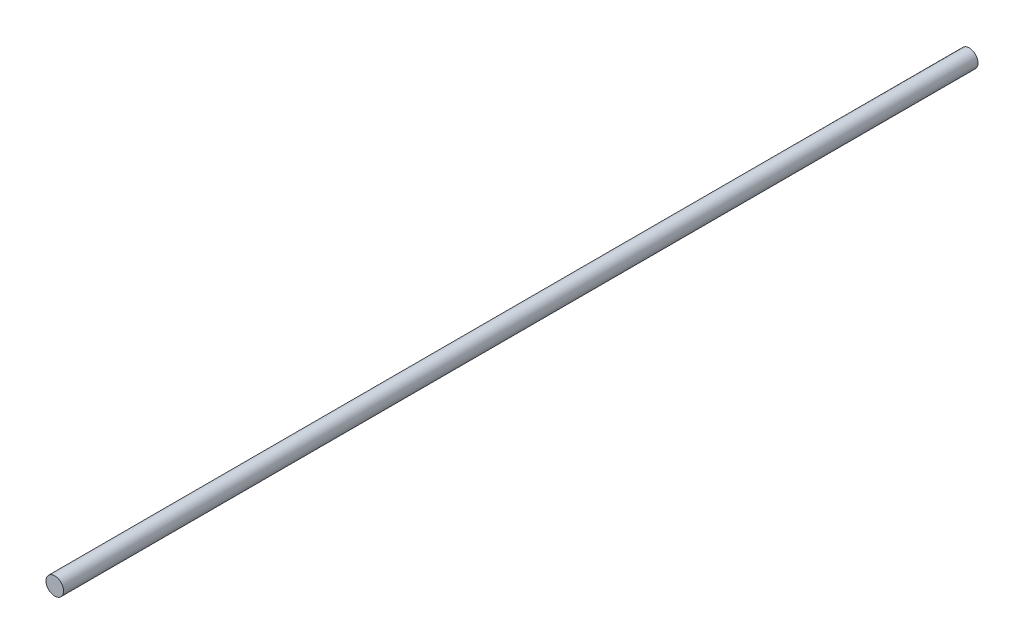
ISO-10303-21;
HEADER;
FILE_DESCRIPTION(('STEP AP214'),'2;1');
FILE_NAME('part.step','',(''),(''),'','','');
FILE_SCHEMA(('AUTOMOTIVE_DESIGN { 1 0 10303 214 1 1 1 1 }'));
ENDSEC;
DATA;
#1=APPLICATION_CONTEXT('core data for automotive mechanical design processes');
#2=APPLICATION_PROTOCOL_DEFINITION('international standard','automotive_design',2000,#1);
#3=PRODUCT_CONTEXT('',#1,'mechanical');
#4=PRODUCT('Part','Part','',(#3));
#5=PRODUCT_RELATED_PRODUCT_CATEGORY('part','',(#4));
#6=PRODUCT_DEFINITION_FORMATION('','',#4);
#7=PRODUCT_DEFINITION_CONTEXT('part definition',#1,'design');
#8=PRODUCT_DEFINITION('design','',#6,#7);
#9=PRODUCT_DEFINITION_SHAPE('','',#8);
#10=(LENGTH_UNIT() NAMED_UNIT(*) SI_UNIT(.MILLI.,.METRE.));
#11=(NAMED_UNIT(*) PLANE_ANGLE_UNIT() SI_UNIT($,.RADIAN.));
#12=(NAMED_UNIT(*) SI_UNIT($,.STERADIAN.) SOLID_ANGLE_UNIT());
#13=UNCERTAINTY_MEASURE_WITH_UNIT(LENGTH_MEASURE(1.E-05),#10,'distance_accuracy_value','');
#14=(GEOMETRIC_REPRESENTATION_CONTEXT(3) GLOBAL_UNCERTAINTY_ASSIGNED_CONTEXT((#13)) GLOBAL_UNIT_ASSIGNED_CONTEXT((#10,
#11,#12)) REPRESENTATION_CONTEXT('',''));
#15=CARTESIAN_POINT('',(0.,0.,0.));
#16=DIRECTION('',(0.,0.,1.));
#17=DIRECTION('',(1.,0.,0.));
#18=AXIS2_PLACEMENT_3D('',#15,#16,#17);
#19=CARTESIAN_POINT('',(0.,0.,330.2));
#20=DIRECTION('',(0.,0.,-1.));
#21=DIRECTION('',(-1.,0.,0.));
#22=AXIS2_PLACEMENT_3D('',#19,#20,#21);
#23=CYLINDRICAL_SURFACE('',#22,3.175);
#24=CARTESIAN_POINT('',(0.,0.,330.2));
#25=DIRECTION('',(0.,0.,1.));
#26=DIRECTION('',(1.,0.,0.));
#27=AXIS2_PLACEMENT_3D('',#24,#25,#26);
#28=CIRCLE('',#27,3.175);
#29=CARTESIAN_POINT('',(3.175,0.,330.2));
#30=VERTEX_POINT('',#29);
#31=EDGE_CURVE('E10',#30,#30,#28,.T.);
#32=ORIENTED_EDGE('',*,*,#31,.F.);
#33=EDGE_LOOP('',(#32));
#34=FACE_BOUND('',#33,.T.);
#35=CARTESIAN_POINT('',(0.,0.,0.));
#36=DIRECTION('',(0.,0.,1.));
#37=DIRECTION('',(1.,0.,0.));
#38=AXIS2_PLACEMENT_3D('',#35,#36,#37);
#39=CIRCLE('',#38,3.175);
#40=CARTESIAN_POINT('',(3.175,0.,0.));
#41=VERTEX_POINT('',#40);
#42=EDGE_CURVE('E36',#41,#41,#39,.T.);
#43=ORIENTED_EDGE('',*,*,#42,.T.);
#44=EDGE_LOOP('',(#43));
#45=FACE_BOUND('',#44,.T.);
#46=ADVANCED_FACE('F33',(#34,#45),#23,.T.);
#47=CARTESIAN_POINT('',(0.,0.,330.2));
#48=DIRECTION('',(0.,0.,1.));
#49=DIRECTION('',(1.,0.,0.));
#50=AXIS2_PLACEMENT_3D('',#47,#48,#49);
#51=PLANE('',#50);
#52=ORIENTED_EDGE('',*,*,#31,.T.);
#53=EDGE_LOOP('',(#52));
#54=FACE_BOUND('',#53,.T.);
#55=ADVANCED_FACE('F49',(#54),#51,.T.);
#56=CARTESIAN_POINT('',(0.,0.,0.));
#57=DIRECTION('',(0.,0.,1.));
#58=DIRECTION('',(1.,0.,0.));
#59=AXIS2_PLACEMENT_3D('',#56,#57,#58);
#60=PLANE('',#59);
#61=ORIENTED_EDGE('',*,*,#42,.F.);
#62=EDGE_LOOP('',(#61));
#63=FACE_BOUND('',#62,.T.);
#64=ADVANCED_FACE('F47',(#63),#60,.F.);
#65=CLOSED_SHELL('',(#46,#55,#64));
#66=MANIFOLD_SOLID_BREP('B2',#65);
#67=ADVANCED_BREP_SHAPE_REPRESENTATION('',(#18,#66),#14);
#68=SHAPE_DEFINITION_REPRESENTATION(#9,#67);
ENDSEC;
END-ISO-10303-21;
